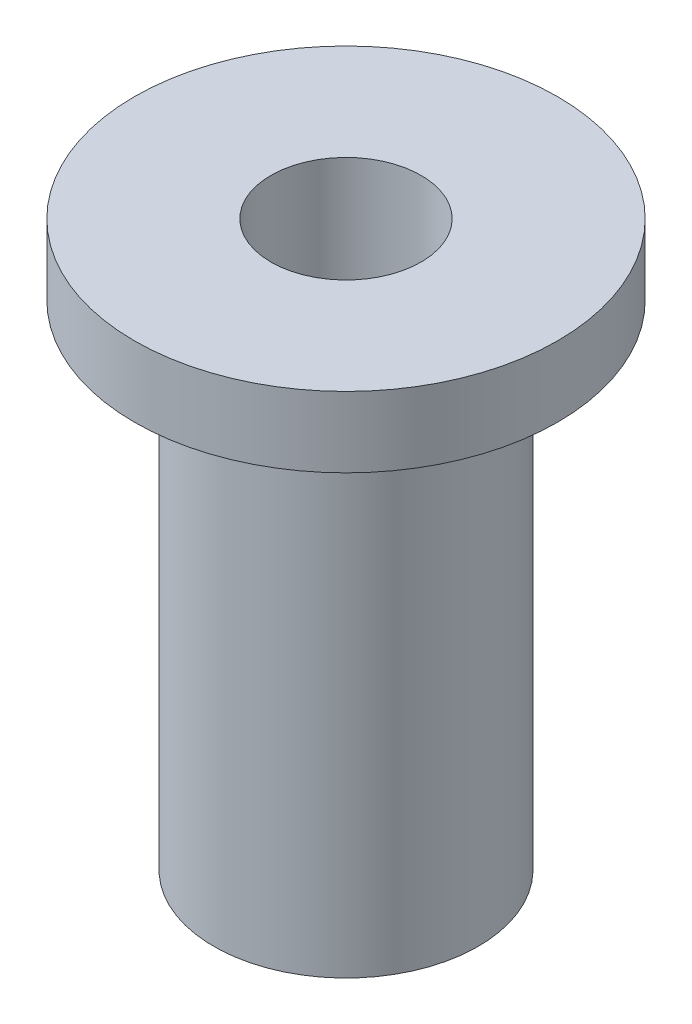
ISO-10303-21;
HEADER;
FILE_DESCRIPTION(('STEP AP214'),'2;1');
FILE_NAME('part.step','',(''),(''),'','','');
FILE_SCHEMA(('AUTOMOTIVE_DESIGN { 1 0 10303 214 1 1 1 1 }'));
ENDSEC;
DATA;
#1=APPLICATION_CONTEXT('core data for automotive mechanical design processes');
#2=APPLICATION_PROTOCOL_DEFINITION('international standard','automotive_design',2000,#1);
#3=PRODUCT_CONTEXT('',#1,'mechanical');
#4=PRODUCT('Part','Part','',(#3));
#5=PRODUCT_RELATED_PRODUCT_CATEGORY('part','',(#4));
#6=PRODUCT_DEFINITION_FORMATION('','',#4);
#7=PRODUCT_DEFINITION_CONTEXT('part definition',#1,'design');
#8=PRODUCT_DEFINITION('design','',#6,#7);
#9=PRODUCT_DEFINITION_SHAPE('','',#8);
#10=(LENGTH_UNIT() NAMED_UNIT(*) SI_UNIT(.MILLI.,.METRE.));
#11=(NAMED_UNIT(*) PLANE_ANGLE_UNIT() SI_UNIT($,.RADIAN.));
#12=(NAMED_UNIT(*) SI_UNIT($,.STERADIAN.) SOLID_ANGLE_UNIT());
#13=UNCERTAINTY_MEASURE_WITH_UNIT(LENGTH_MEASURE(1.E-05),#10,'distance_accuracy_value','');
#14=(GEOMETRIC_REPRESENTATION_CONTEXT(3) GLOBAL_UNCERTAINTY_ASSIGNED_CONTEXT((#13)) GLOBAL_UNIT_ASSIGNED_CONTEXT((#10,
#11,#12)) REPRESENTATION_CONTEXT('',''));
#15=CARTESIAN_POINT('',(0.,0.,0.));
#16=DIRECTION('',(0.,0.,1.));
#17=DIRECTION('',(1.,0.,0.));
#18=AXIS2_PLACEMENT_3D('',#15,#16,#17);
#19=CARTESIAN_POINT('',(0.,193.96,0.));
#20=DIRECTION('',(0.,-1.,0.));
#21=DIRECTION('',(0.,0.,-1.));
#22=AXIS2_PLACEMENT_3D('',#19,#20,#21);
#23=PLANE('',#22);
#24=CARTESIAN_POINT('',(0.,193.96,0.));
#25=DIRECTION('',(0.,1.,0.));
#26=DIRECTION('',(0.,0.,1.));
#27=AXIS2_PLACEMENT_3D('',#24,#25,#26);
#28=CIRCLE('',#27,1.35255);
#29=CARTESIAN_POINT('',(0.,193.96,1.35255));
#30=VERTEX_POINT('',#29);
#31=EDGE_CURVE('E54',#30,#30,#28,.T.);
#32=ORIENTED_EDGE('',*,*,#31,.T.);
#33=EDGE_LOOP('',(#32));
#34=FACE_BOUND('',#33,.T.);
#35=CARTESIAN_POINT('',(0.,193.96,0.));
#36=DIRECTION('',(0.,-1.,0.));
#37=DIRECTION('',(0.,0.,-1.));
#38=AXIS2_PLACEMENT_3D('',#35,#36,#37);
#39=CIRCLE('',#38,2.38125);
#40=CARTESIAN_POINT('',(0.,193.96,-2.38125));
#41=VERTEX_POINT('',#40);
#42=EDGE_CURVE('E10',#41,#41,#39,.T.);
#43=ORIENTED_EDGE('',*,*,#42,.T.);
#44=EDGE_LOOP('',(#43));
#45=FACE_BOUND('',#44,.T.);
#46=ADVANCED_FACE('F35',(#34,#45),#23,.T.);
#47=CARTESIAN_POINT('',(0.,0.,0.));
#48=DIRECTION('',(0.,-1.,0.));
#49=DIRECTION('',(0.,0.,-1.));
#50=AXIS2_PLACEMENT_3D('',#47,#48,#49);
#51=CYLINDRICAL_SURFACE('',#50,2.38125);
#52=CARTESIAN_POINT('',(0.,202.85,0.));
#53=DIRECTION('',(0.,-1.,0.));
#54=DIRECTION('',(0.,0.,-1.));
#55=AXIS2_PLACEMENT_3D('',#52,#53,#54);
#56=CIRCLE('',#55,2.38125);
#57=CARTESIAN_POINT('',(0.,202.85,-2.38125));
#58=VERTEX_POINT('',#57);
#59=EDGE_CURVE('E41',#58,#58,#56,.T.);
#60=ORIENTED_EDGE('',*,*,#59,.T.);
#61=EDGE_LOOP('',(#60));
#62=FACE_BOUND('',#61,.T.);
#63=ORIENTED_EDGE('',*,*,#42,.F.);
#64=EDGE_LOOP('',(#63));
#65=FACE_BOUND('',#64,.T.);
#66=ADVANCED_FACE('F78',(#62,#65),#51,.T.);
#67=CARTESIAN_POINT('',(2.38125,202.85,0.));
#68=DIRECTION('',(0.,-1.,0.));
#69=DIRECTION('',(0.,0.,-1.));
#70=AXIS2_PLACEMENT_3D('',#67,#68,#69);
#71=PLANE('',#70);
#72=CARTESIAN_POINT('',(0.,202.85,0.));
#73=DIRECTION('',(0.,-1.,0.));
#74=DIRECTION('',(0.,0.,-1.));
#75=AXIS2_PLACEMENT_3D('',#72,#73,#74);
#76=CIRCLE('',#75,3.81);
#77=CARTESIAN_POINT('',(0.,202.85,-3.81));
#78=VERTEX_POINT('',#77);
#79=EDGE_CURVE('E45',#78,#78,#76,.T.);
#80=ORIENTED_EDGE('',*,*,#79,.T.);
#81=EDGE_LOOP('',(#80));
#82=FACE_BOUND('',#81,.T.);
#83=ORIENTED_EDGE('',*,*,#59,.F.);
#84=EDGE_LOOP('',(#83));
#85=FACE_BOUND('',#84,.T.);
#86=ADVANCED_FACE('F72',(#82,#85),#71,.T.);
#87=CARTESIAN_POINT('',(0.,0.,0.));
#88=DIRECTION('',(0.,-1.,0.));
#89=DIRECTION('',(0.,0.,-1.));
#90=AXIS2_PLACEMENT_3D('',#87,#88,#89);
#91=CYLINDRICAL_SURFACE('',#90,3.81);
#92=CARTESIAN_POINT('',(0.,204.12,0.));
#93=DIRECTION('',(0.,-1.,0.));
#94=DIRECTION('',(0.,0.,-1.));
#95=AXIS2_PLACEMENT_3D('',#92,#93,#94);
#96=CIRCLE('',#95,3.81);
#97=CARTESIAN_POINT('',(0.,204.12,-3.81));
#98=VERTEX_POINT('',#97);
#99=EDGE_CURVE('E49',#98,#98,#96,.T.);
#100=ORIENTED_EDGE('',*,*,#99,.T.);
#101=EDGE_LOOP('',(#100));
#102=FACE_BOUND('',#101,.T.);
#103=ORIENTED_EDGE('',*,*,#79,.F.);
#104=EDGE_LOOP('',(#103));
#105=FACE_BOUND('',#104,.T.);
#106=ADVANCED_FACE('F66',(#102,#105),#91,.T.);
#107=CARTESIAN_POINT('',(0.,204.12,0.));
#108=DIRECTION('',(0.,1.,0.));
#109=DIRECTION('',(0.,0.,1.));
#110=AXIS2_PLACEMENT_3D('',#107,#108,#109);
#111=PLANE('',#110);
#112=CARTESIAN_POINT('',(0.,204.12,0.));
#113=DIRECTION('',(0.,1.,0.));
#114=DIRECTION('',(0.,0.,1.));
#115=AXIS2_PLACEMENT_3D('',#112,#113,#114);
#116=CIRCLE('',#115,1.35255);
#117=CARTESIAN_POINT('',(0.,204.12,1.35255));
#118=VERTEX_POINT('',#117);
#119=EDGE_CURVE('E57',#118,#118,#116,.T.);
#120=ORIENTED_EDGE('',*,*,#119,.F.);
#121=EDGE_LOOP('',(#120));
#122=FACE_BOUND('',#121,.T.);
#123=ORIENTED_EDGE('',*,*,#99,.F.);
#124=EDGE_LOOP('',(#123));
#125=FACE_BOUND('',#124,.T.);
#126=ADVANCED_FACE('F63',(#122,#125),#111,.T.);
#127=CARTESIAN_POINT('',(0.,204.12,0.));
#128=DIRECTION('',(0.,1.,0.));
#129=DIRECTION('',(0.,0.,1.));
#130=AXIS2_PLACEMENT_3D('',#127,#128,#129);
#131=CYLINDRICAL_SURFACE('',#130,1.35255);
#132=ORIENTED_EDGE('',*,*,#31,.F.);
#133=EDGE_LOOP('',(#132));
#134=FACE_BOUND('',#133,.T.);
#135=ORIENTED_EDGE('',*,*,#119,.T.);
#136=EDGE_LOOP('',(#135));
#137=FACE_BOUND('',#136,.T.);
#138=ADVANCED_FACE('F61',(#134,#137),#131,.F.);
#139=CLOSED_SHELL('',(#46,#66,#86,#106,#126,#138));
#140=MANIFOLD_SOLID_BREP('B2',#139);
#141=ADVANCED_BREP_SHAPE_REPRESENTATION('',(#18,#140),#14);
#142=SHAPE_DEFINITION_REPRESENTATION(#9,#141);
ENDSEC;
END-ISO-10303-21;
